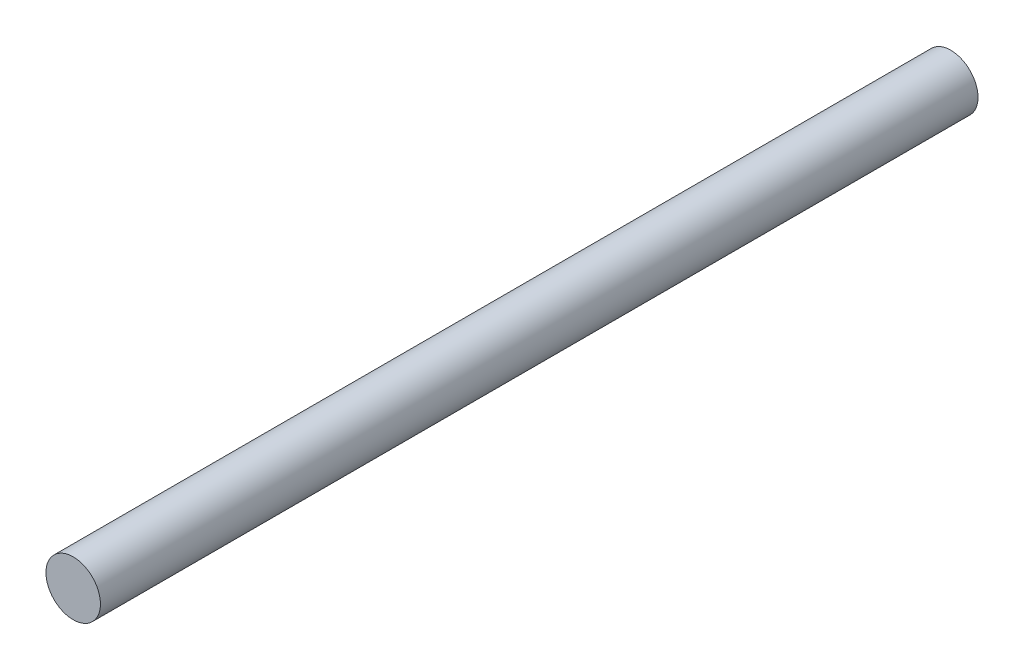
ISO-10303-21;
HEADER;
FILE_DESCRIPTION(('STEP AP214'),'2;1');
FILE_NAME('part.step','',(''),(''),'','','');
FILE_SCHEMA(('AUTOMOTIVE_DESIGN { 1 0 10303 214 1 1 1 1 }'));
ENDSEC;
DATA;
#1=APPLICATION_CONTEXT('core data for automotive mechanical design processes');
#2=APPLICATION_PROTOCOL_DEFINITION('international standard','automotive_design',2000,#1);
#3=PRODUCT_CONTEXT('',#1,'mechanical');
#4=PRODUCT('Part','Part','',(#3));
#5=PRODUCT_RELATED_PRODUCT_CATEGORY('part','',(#4));
#6=PRODUCT_DEFINITION_FORMATION('','',#4);
#7=PRODUCT_DEFINITION_CONTEXT('part definition',#1,'design');
#8=PRODUCT_DEFINITION('design','',#6,#7);
#9=PRODUCT_DEFINITION_SHAPE('','',#8);
#10=(LENGTH_UNIT() NAMED_UNIT(*) SI_UNIT(.MILLI.,.METRE.));
#11=(NAMED_UNIT(*) PLANE_ANGLE_UNIT() SI_UNIT($,.RADIAN.));
#12=(NAMED_UNIT(*) SI_UNIT($,.STERADIAN.) SOLID_ANGLE_UNIT());
#13=UNCERTAINTY_MEASURE_WITH_UNIT(LENGTH_MEASURE(1.E-05),#10,'distance_accuracy_value','');
#14=(GEOMETRIC_REPRESENTATION_CONTEXT(3) GLOBAL_UNCERTAINTY_ASSIGNED_CONTEXT((#13)) GLOBAL_UNIT_ASSIGNED_CONTEXT((#10,
#11,#12)) REPRESENTATION_CONTEXT('',''));
#15=CARTESIAN_POINT('',(0.,0.,0.));
#16=DIRECTION('',(0.,0.,1.));
#17=DIRECTION('',(1.,0.,0.));
#18=AXIS2_PLACEMENT_3D('',#15,#16,#17);
#19=CARTESIAN_POINT('',(0.,0.,-283.2));
#20=DIRECTION('',(0.,0.,1.));
#21=DIRECTION('',(1.,0.,0.));
#22=AXIS2_PLACEMENT_3D('',#19,#20,#21);
#23=CYLINDRICAL_SURFACE('',#22,8.89);
#24=CARTESIAN_POINT('',(0.,0.,-283.2));
#25=DIRECTION('',(0.,0.,1.));
#26=DIRECTION('',(1.,0.,0.));
#27=AXIS2_PLACEMENT_3D('',#24,#25,#26);
#28=CIRCLE('',#27,8.89);
#29=CARTESIAN_POINT('',(8.89,0.,-283.2));
#30=VERTEX_POINT('',#29);
#31=EDGE_CURVE('E10',#30,#30,#28,.T.);
#32=ORIENTED_EDGE('',*,*,#31,.T.);
#33=EDGE_LOOP('',(#32));
#34=FACE_BOUND('',#33,.T.);
#35=CARTESIAN_POINT('',(0.,0.,3.19999999999996));
#36=DIRECTION('',(0.,0.,1.));
#37=DIRECTION('',(1.,0.,0.));
#38=AXIS2_PLACEMENT_3D('',#35,#36,#37);
#39=CIRCLE('',#38,8.89);
#40=CARTESIAN_POINT('',(8.89,0.,3.19999999999996));
#41=VERTEX_POINT('',#40);
#42=EDGE_CURVE('E41',#41,#41,#39,.T.);
#43=ORIENTED_EDGE('',*,*,#42,.F.);
#44=EDGE_LOOP('',(#43));
#45=FACE_BOUND('',#44,.T.);
#46=ADVANCED_FACE('F35',(#34,#45),#23,.T.);
#47=CARTESIAN_POINT('',(0.,0.,-283.2));
#48=DIRECTION('',(0.,0.,1.));
#49=DIRECTION('',(1.,0.,0.));
#50=AXIS2_PLACEMENT_3D('',#47,#48,#49);
#51=PLANE('',#50);
#52=ORIENTED_EDGE('',*,*,#31,.F.);
#53=EDGE_LOOP('',(#52));
#54=FACE_BOUND('',#53,.T.);
#55=ADVANCED_FACE('F50',(#54),#51,.F.);
#56=CARTESIAN_POINT('',(0.,0.,3.19999999999996));
#57=DIRECTION('',(0.,0.,1.));
#58=DIRECTION('',(1.,0.,0.));
#59=AXIS2_PLACEMENT_3D('',#56,#57,#58);
#60=PLANE('',#59);
#61=ORIENTED_EDGE('',*,*,#42,.T.);
#62=EDGE_LOOP('',(#61));
#63=FACE_BOUND('',#62,.T.);
#64=ADVANCED_FACE('F47',(#63),#60,.T.);
#65=CLOSED_SHELL('',(#46,#55,#64));
#66=MANIFOLD_SOLID_BREP('B2',#65);
#67=ADVANCED_BREP_SHAPE_REPRESENTATION('',(#18,#66),#14);
#68=SHAPE_DEFINITION_REPRESENTATION(#9,#67);
ENDSEC;
END-ISO-10303-21;
